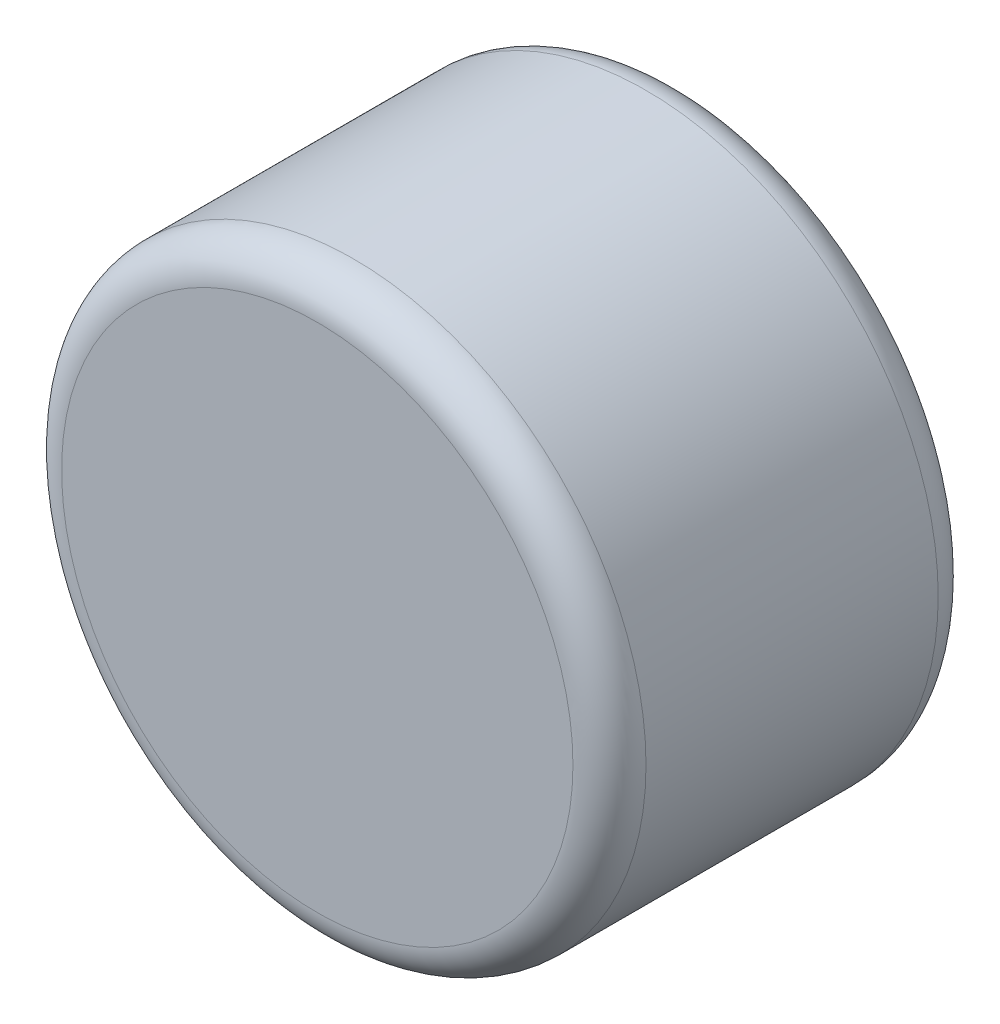
ISO-10303-21;
HEADER;
FILE_DESCRIPTION(('STEP AP214'),'2;1');
FILE_NAME('part.step','',(''),(''),'','','');
FILE_SCHEMA(('AUTOMOTIVE_DESIGN { 1 0 10303 214 1 1 1 1 }'));
ENDSEC;
DATA;
#1=APPLICATION_CONTEXT('core data for automotive mechanical design processes');
#2=APPLICATION_PROTOCOL_DEFINITION('international standard','automotive_design',2000,#1);
#3=PRODUCT_CONTEXT('',#1,'mechanical');
#4=PRODUCT('Part','Part','',(#3));
#5=PRODUCT_RELATED_PRODUCT_CATEGORY('part','',(#4));
#6=PRODUCT_DEFINITION_FORMATION('','',#4);
#7=PRODUCT_DEFINITION_CONTEXT('part definition',#1,'design');
#8=PRODUCT_DEFINITION('design','',#6,#7);
#9=PRODUCT_DEFINITION_SHAPE('','',#8);
#10=(LENGTH_UNIT() NAMED_UNIT(*) SI_UNIT(.MILLI.,.METRE.));
#11=(NAMED_UNIT(*) PLANE_ANGLE_UNIT() SI_UNIT($,.RADIAN.));
#12=(NAMED_UNIT(*) SI_UNIT($,.STERADIAN.) SOLID_ANGLE_UNIT());
#13=UNCERTAINTY_MEASURE_WITH_UNIT(LENGTH_MEASURE(1.E-05),#10,'distance_accuracy_value','');
#14=(GEOMETRIC_REPRESENTATION_CONTEXT(3) GLOBAL_UNCERTAINTY_ASSIGNED_CONTEXT((#13)) GLOBAL_UNIT_ASSIGNED_CONTEXT((#10,
#11,#12)) REPRESENTATION_CONTEXT('',''));
#15=CARTESIAN_POINT('',(0.,0.,0.));
#16=DIRECTION('',(0.,0.,1.));
#17=DIRECTION('',(1.,0.,0.));
#18=AXIS2_PLACEMENT_3D('',#15,#16,#17);
#19=CARTESIAN_POINT('',(0.,0.,5.));
#20=DIRECTION('',(0.,0.,-1.));
#21=DIRECTION('',(-1.,0.,0.));
#22=AXIS2_PLACEMENT_3D('',#19,#20,#21);
#23=CYLINDRICAL_SURFACE('',#22,4.);
#24=CARTESIAN_POINT('',(0.,0.,0.5));
#25=DIRECTION('',(0.,0.,1.));
#26=DIRECTION('',(1.,0.,0.));
#27=AXIS2_PLACEMENT_3D('',#24,#25,#26);
#28=CIRCLE('',#27,4.);
#29=CARTESIAN_POINT('',(4.,0.,0.5));
#30=VERTEX_POINT('',#29);
#31=EDGE_CURVE('E41',#30,#30,#28,.T.);
#32=ORIENTED_EDGE('',*,*,#31,.T.);
#33=EDGE_LOOP('',(#32));
#34=FACE_BOUND('',#33,.T.);
#35=CARTESIAN_POINT('',(0.,0.,4.5));
#36=DIRECTION('',(0.,0.,1.));
#37=DIRECTION('',(1.,0.,0.));
#38=AXIS2_PLACEMENT_3D('',#35,#36,#37);
#39=CIRCLE('',#38,4.);
#40=CARTESIAN_POINT('',(4.,0.,4.5));
#41=VERTEX_POINT('',#40);
#42=EDGE_CURVE('E45',#41,#41,#39,.F.);
#43=ORIENTED_EDGE('',*,*,#42,.T.);
#44=EDGE_LOOP('',(#43));
#45=FACE_BOUND('',#44,.T.);
#46=ADVANCED_FACE('F30',(#34,#45),#23,.T.);
#47=CARTESIAN_POINT('',(0.,0.,5.));
#48=DIRECTION('',(0.,0.,1.));
#49=DIRECTION('',(1.,0.,0.));
#50=AXIS2_PLACEMENT_3D('',#47,#48,#49);
#51=PLANE('',#50);
#52=CARTESIAN_POINT('',(0.,0.,5.));
#53=DIRECTION('',(0.,0.,1.));
#54=DIRECTION('',(1.,0.,0.));
#55=AXIS2_PLACEMENT_3D('',#52,#53,#54);
#56=CIRCLE('',#55,3.5);
#57=CARTESIAN_POINT('',(3.5,0.,5.));
#58=VERTEX_POINT('',#57);
#59=EDGE_CURVE('E10',#58,#58,#56,.T.);
#60=ORIENTED_EDGE('',*,*,#59,.T.);
#61=EDGE_LOOP('',(#60));
#62=FACE_BOUND('',#61,.T.);
#63=ADVANCED_FACE('F61',(#62),#51,.T.);
#64=CARTESIAN_POINT('',(0.,0.,0.));
#65=DIRECTION('',(0.,0.,1.));
#66=DIRECTION('',(1.,0.,0.));
#67=AXIS2_PLACEMENT_3D('',#64,#65,#66);
#68=PLANE('',#67);
#69=CARTESIAN_POINT('',(0.,0.,0.));
#70=DIRECTION('',(0.,0.,1.));
#71=DIRECTION('',(1.,0.,0.));
#72=AXIS2_PLACEMENT_3D('',#69,#70,#71);
#73=CIRCLE('',#72,3.5);
#74=CARTESIAN_POINT('',(3.5,0.,0.));
#75=VERTEX_POINT('',#74);
#76=EDGE_CURVE('E37',#75,#75,#73,.F.);
#77=ORIENTED_EDGE('',*,*,#76,.T.);
#78=EDGE_LOOP('',(#77));
#79=FACE_BOUND('',#78,.T.);
#80=ADVANCED_FACE('F58',(#79),#68,.F.);
#81=CARTESIAN_POINT('',(0.,0.,0.5));
#82=DIRECTION('',(0.,0.,1.));
#83=DIRECTION('',(1.,0.,0.));
#84=AXIS2_PLACEMENT_3D('',#81,#82,#83);
#85=TOROIDAL_SURFACE('',#84,3.5,0.5);
#86=ORIENTED_EDGE('',*,*,#76,.F.);
#87=EDGE_LOOP('',(#86));
#88=FACE_BOUND('',#87,.T.);
#89=ORIENTED_EDGE('',*,*,#31,.F.);
#90=EDGE_LOOP('',(#89));
#91=FACE_BOUND('',#90,.T.);
#92=ADVANCED_FACE('F54',(#88,#91),#85,.T.);
#93=CARTESIAN_POINT('',(0.,0.,4.5));
#94=DIRECTION('',(0.,0.,1.));
#95=DIRECTION('',(1.,0.,0.));
#96=AXIS2_PLACEMENT_3D('',#93,#94,#95);
#97=TOROIDAL_SURFACE('',#96,3.5,0.5);
#98=ORIENTED_EDGE('',*,*,#42,.F.);
#99=EDGE_LOOP('',(#98));
#100=FACE_BOUND('',#99,.T.);
#101=ORIENTED_EDGE('',*,*,#59,.F.);
#102=EDGE_LOOP('',(#101));
#103=FACE_BOUND('',#102,.T.);
#104=ADVANCED_FACE('F32',(#100,#103),#97,.T.);
#105=CLOSED_SHELL('',(#46,#63,#80,#92,#104));
#106=MANIFOLD_SOLID_BREP('B2',#105);
#107=ADVANCED_BREP_SHAPE_REPRESENTATION('',(#18,#106),#14);
#108=SHAPE_DEFINITION_REPRESENTATION(#9,#107);
ENDSEC;
END-ISO-10303-21;
